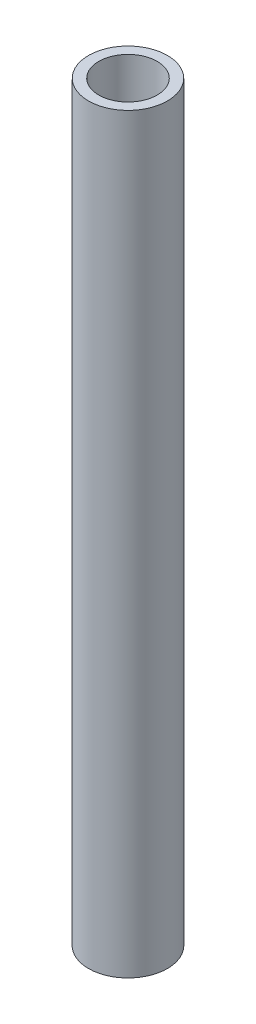
ISO-10303-21;
HEADER;
FILE_DESCRIPTION(('STEP AP214'),'2;1');
FILE_NAME('part.step','',(''),(''),'','','');
FILE_SCHEMA(('AUTOMOTIVE_DESIGN { 1 0 10303 214 1 1 1 1 }'));
ENDSEC;
DATA;
#1=APPLICATION_CONTEXT('core data for automotive mechanical design processes');
#2=APPLICATION_PROTOCOL_DEFINITION('international standard','automotive_design',2000,#1);
#3=PRODUCT_CONTEXT('',#1,'mechanical');
#4=PRODUCT('Part','Part','',(#3));
#5=PRODUCT_RELATED_PRODUCT_CATEGORY('part','',(#4));
#6=PRODUCT_DEFINITION_FORMATION('','',#4);
#7=PRODUCT_DEFINITION_CONTEXT('part definition',#1,'design');
#8=PRODUCT_DEFINITION('design','',#6,#7);
#9=PRODUCT_DEFINITION_SHAPE('','',#8);
#10=(LENGTH_UNIT() NAMED_UNIT(*) SI_UNIT(.MILLI.,.METRE.));
#11=(NAMED_UNIT(*) PLANE_ANGLE_UNIT() SI_UNIT($,.RADIAN.));
#12=(NAMED_UNIT(*) SI_UNIT($,.STERADIAN.) SOLID_ANGLE_UNIT());
#13=UNCERTAINTY_MEASURE_WITH_UNIT(LENGTH_MEASURE(1.E-05),#10,'distance_accuracy_value','');
#14=(GEOMETRIC_REPRESENTATION_CONTEXT(3) GLOBAL_UNCERTAINTY_ASSIGNED_CONTEXT((#13)) GLOBAL_UNIT_ASSIGNED_CONTEXT((#10,
#11,#12)) REPRESENTATION_CONTEXT('',''));
#15=CARTESIAN_POINT('',(0.,0.,0.));
#16=DIRECTION('',(0.,0.,1.));
#17=DIRECTION('',(1.,0.,0.));
#18=AXIS2_PLACEMENT_3D('',#15,#16,#17);
#19=CARTESIAN_POINT('',(0.,203.2,0.));
#20=DIRECTION('',(0.,1.,0.));
#21=DIRECTION('',(0.,0.,1.));
#22=AXIS2_PLACEMENT_3D('',#19,#20,#21);
#23=PLANE('',#22);
#24=CARTESIAN_POINT('',(0.,203.2,0.));
#25=DIRECTION('',(0.,1.,0.));
#26=DIRECTION('',(0.,0.,1.));
#27=AXIS2_PLACEMENT_3D('',#24,#25,#26);
#28=CIRCLE('',#27,10.668);
#29=CARTESIAN_POINT('',(0.,203.2,10.668));
#30=VERTEX_POINT('',#29);
#31=EDGE_CURVE('E10',#30,#30,#28,.T.);
#32=ORIENTED_EDGE('',*,*,#31,.T.);
#33=EDGE_LOOP('',(#32));
#34=FACE_BOUND('',#33,.T.);
#35=CARTESIAN_POINT('',(0.,203.2,0.));
#36=DIRECTION('',(0.,1.,0.));
#37=DIRECTION('',(0.,0.,1.));
#38=AXIS2_PLACEMENT_3D('',#35,#36,#37);
#39=CIRCLE('',#38,7.8994);
#40=CARTESIAN_POINT('',(0.,203.2,7.8994));
#41=VERTEX_POINT('',#40);
#42=EDGE_CURVE('E45',#41,#41,#39,.T.);
#43=ORIENTED_EDGE('',*,*,#42,.F.);
#44=EDGE_LOOP('',(#43));
#45=FACE_BOUND('',#44,.T.);
#46=ADVANCED_FACE('F34',(#34,#45),#23,.T.);
#47=CARTESIAN_POINT('',(0.,0.,0.));
#48=DIRECTION('',(0.,1.,0.));
#49=DIRECTION('',(0.,0.,1.));
#50=AXIS2_PLACEMENT_3D('',#47,#48,#49);
#51=PLANE('',#50);
#52=CARTESIAN_POINT('',(0.,0.,0.));
#53=DIRECTION('',(0.,1.,0.));
#54=DIRECTION('',(0.,0.,1.));
#55=AXIS2_PLACEMENT_3D('',#52,#53,#54);
#56=CIRCLE('',#55,10.668);
#57=CARTESIAN_POINT('',(0.,0.,10.668));
#58=VERTEX_POINT('',#57);
#59=EDGE_CURVE('E38',#58,#58,#56,.T.);
#60=ORIENTED_EDGE('',*,*,#59,.F.);
#61=EDGE_LOOP('',(#60));
#62=FACE_BOUND('',#61,.T.);
#63=CARTESIAN_POINT('',(0.,0.,0.));
#64=DIRECTION('',(0.,1.,0.));
#65=DIRECTION('',(0.,0.,1.));
#66=AXIS2_PLACEMENT_3D('',#63,#64,#65);
#67=CIRCLE('',#66,7.8994);
#68=CARTESIAN_POINT('',(0.,0.,7.8994));
#69=VERTEX_POINT('',#68);
#70=EDGE_CURVE('E47',#69,#69,#67,.T.);
#71=ORIENTED_EDGE('',*,*,#70,.T.);
#72=EDGE_LOOP('',(#71));
#73=FACE_BOUND('',#72,.T.);
#74=ADVANCED_FACE('F57',(#62,#73),#51,.F.);
#75=CARTESIAN_POINT('',(0.,203.2,0.));
#76=DIRECTION('',(0.,-1.,0.));
#77=DIRECTION('',(0.,0.,-1.));
#78=AXIS2_PLACEMENT_3D('',#75,#76,#77);
#79=CYLINDRICAL_SURFACE('',#78,10.668);
#80=ORIENTED_EDGE('',*,*,#31,.F.);
#81=EDGE_LOOP('',(#80));
#82=FACE_BOUND('',#81,.T.);
#83=ORIENTED_EDGE('',*,*,#59,.T.);
#84=EDGE_LOOP('',(#83));
#85=FACE_BOUND('',#84,.T.);
#86=ADVANCED_FACE('F36',(#82,#85),#79,.T.);
#87=CARTESIAN_POINT('',(0.,203.2,0.));
#88=DIRECTION('',(0.,-1.,0.));
#89=DIRECTION('',(0.,0.,-1.));
#90=AXIS2_PLACEMENT_3D('',#87,#88,#89);
#91=CYLINDRICAL_SURFACE('',#90,7.8994);
#92=ORIENTED_EDGE('',*,*,#42,.T.);
#93=EDGE_LOOP('',(#92));
#94=FACE_BOUND('',#93,.T.);
#95=ORIENTED_EDGE('',*,*,#70,.F.);
#96=EDGE_LOOP('',(#95));
#97=FACE_BOUND('',#96,.T.);
#98=ADVANCED_FACE('F53',(#94,#97),#91,.F.);
#99=CLOSED_SHELL('',(#46,#74,#86,#98));
#100=MANIFOLD_SOLID_BREP('B2',#99);
#101=ADVANCED_BREP_SHAPE_REPRESENTATION('',(#18,#100),#14);
#102=SHAPE_DEFINITION_REPRESENTATION(#9,#101);
ENDSEC;
END-ISO-10303-21;
